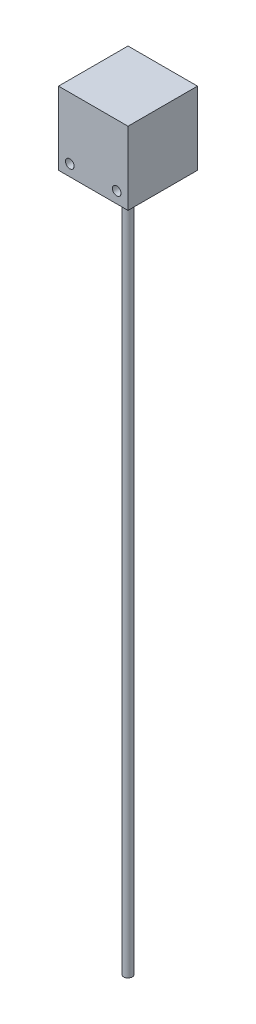
ISO-10303-21;
HEADER;
FILE_DESCRIPTION(('STEP AP214'),'2;1');
FILE_NAME('part.step','',(''),(''),'','','');
FILE_SCHEMA(('AUTOMOTIVE_DESIGN { 1 0 10303 214 1 1 1 1 }'));
ENDSEC;
DATA;
#1=APPLICATION_CONTEXT('core data for automotive mechanical design processes');
#2=APPLICATION_PROTOCOL_DEFINITION('international standard','automotive_design',2000,#1);
#3=PRODUCT_CONTEXT('',#1,'mechanical');
#4=PRODUCT('Part','Part','',(#3));
#5=PRODUCT_RELATED_PRODUCT_CATEGORY('part','',(#4));
#6=PRODUCT_DEFINITION_FORMATION('','',#4);
#7=PRODUCT_DEFINITION_CONTEXT('part definition',#1,'design');
#8=PRODUCT_DEFINITION('design','',#6,#7);
#9=PRODUCT_DEFINITION_SHAPE('','',#8);
#10=(LENGTH_UNIT() NAMED_UNIT(*) SI_UNIT(.MILLI.,.METRE.));
#11=(NAMED_UNIT(*) PLANE_ANGLE_UNIT() SI_UNIT($,.RADIAN.));
#12=(NAMED_UNIT(*) SI_UNIT($,.STERADIAN.) SOLID_ANGLE_UNIT());
#13=UNCERTAINTY_MEASURE_WITH_UNIT(LENGTH_MEASURE(1.E-05),#10,'distance_accuracy_value','');
#14=(GEOMETRIC_REPRESENTATION_CONTEXT(3) GLOBAL_UNCERTAINTY_ASSIGNED_CONTEXT((#13)) GLOBAL_UNIT_ASSIGNED_CONTEXT((#10,
#11,#12)) REPRESENTATION_CONTEXT('',''));
#15=CARTESIAN_POINT('',(0.,0.,0.));
#16=DIRECTION('',(0.,0.,1.));
#17=DIRECTION('',(1.,0.,0.));
#18=AXIS2_PLACEMENT_3D('',#15,#16,#17);
#19=CARTESIAN_POINT('',(0.,0.,20.));
#20=DIRECTION('',(0.,0.,1.));
#21=DIRECTION('',(1.,0.,0.));
#22=AXIS2_PLACEMENT_3D('',#19,#20,#21);
#23=PLANE('',#22);
#24=CARTESIAN_POINT('',(33.5,-35.5,20.));
#25=DIRECTION('',(0.,0.,1.));
#26=DIRECTION('',(1.,0.,0.));
#27=AXIS2_PLACEMENT_3D('',#24,#25,#26);
#28=CIRCLE('',#27,2.5);
#29=CARTESIAN_POINT('',(36.,-35.5,20.));
#30=VERTEX_POINT('',#29);
#31=EDGE_CURVE('E134',#30,#30,#28,.F.);
#32=ORIENTED_EDGE('',*,*,#31,.T.);
#33=EDGE_LOOP('',(#32));
#34=FACE_BOUND('',#33,.T.);
#35=DIRECTION('',(1.,0.,0.));
#36=VECTOR('',#35,1.);
#37=CARTESIAN_POINT('',(0.,-42.,20.));
#38=LINE('',#37,#36);
#39=CARTESIAN_POINT('',(0.,-42.,20.));
#40=VERTEX_POINT('',#39);
#41=CARTESIAN_POINT('',(40.,-42.,20.));
#42=VERTEX_POINT('',#41);
#43=EDGE_CURVE('E78',#40,#42,#38,.T.);
#44=ORIENTED_EDGE('',*,*,#43,.T.);
#45=DIRECTION('',(0.,-1.,0.));
#46=VECTOR('',#45,1.);
#47=CARTESIAN_POINT('',(40.,0.,20.));
#48=LINE('',#47,#46);
#49=CARTESIAN_POINT('',(40.,0.,20.));
#50=VERTEX_POINT('',#49);
#51=EDGE_CURVE('E85',#50,#42,#48,.T.);
#52=ORIENTED_EDGE('',*,*,#51,.F.);
#53=DIRECTION('',(1.,0.,0.));
#54=VECTOR('',#53,1.);
#55=CARTESIAN_POINT('',(0.,0.,20.));
#56=LINE('',#55,#54);
#57=CARTESIAN_POINT('',(0.,0.,20.));
#58=VERTEX_POINT('',#57);
#59=EDGE_CURVE('E93',#58,#50,#56,.T.);
#60=ORIENTED_EDGE('',*,*,#59,.F.);
#61=DIRECTION('',(0.,-1.,0.));
#62=VECTOR('',#61,1.);
#63=CARTESIAN_POINT('',(0.,0.,20.));
#64=LINE('',#63,#62);
#65=EDGE_CURVE('E55',#58,#40,#64,.T.);
#66=ORIENTED_EDGE('',*,*,#65,.T.);
#67=EDGE_LOOP('',(#44,#52,#60,#66));
#68=FACE_BOUND('',#67,.T.);
#69=CARTESIAN_POINT('',(6.5,-35.5,20.));
#70=DIRECTION('',(0.,0.,1.));
#71=DIRECTION('',(1.,0.,0.));
#72=AXIS2_PLACEMENT_3D('',#69,#70,#71);
#73=CIRCLE('',#72,2.5);
#74=CARTESIAN_POINT('',(9.00000000000001,-35.5,20.));
#75=VERTEX_POINT('',#74);
#76=EDGE_CURVE('E126',#75,#75,#73,.T.);
#77=ORIENTED_EDGE('',*,*,#76,.F.);
#78=EDGE_LOOP('',(#77));
#79=FACE_BOUND('',#78,.T.);
#80=ADVANCED_FACE('F38',(#34,#68,#79),#23,.T.);
#81=CARTESIAN_POINT('',(0.,0.,-20.));
#82=DIRECTION('',(0.,0.,1.));
#83=DIRECTION('',(1.,0.,0.));
#84=AXIS2_PLACEMENT_3D('',#81,#82,#83);
#85=PLANE('',#84);
#86=DIRECTION('',(1.,0.,0.));
#87=VECTOR('',#86,1.);
#88=CARTESIAN_POINT('',(0.,-42.,-20.));
#89=LINE('',#88,#87);
#90=CARTESIAN_POINT('',(0.,-42.,-20.));
#91=VERTEX_POINT('',#90);
#92=CARTESIAN_POINT('',(40.,-42.,-20.));
#93=VERTEX_POINT('',#92);
#94=EDGE_CURVE('E101',#91,#93,#89,.T.);
#95=ORIENTED_EDGE('',*,*,#94,.F.);
#96=DIRECTION('',(0.,-1.,0.));
#97=VECTOR('',#96,1.);
#98=CARTESIAN_POINT('',(0.,0.,-20.));
#99=LINE('',#98,#97);
#100=CARTESIAN_POINT('',(0.,0.,-20.));
#101=VERTEX_POINT('',#100);
#102=EDGE_CURVE('E73',#101,#91,#99,.T.);
#103=ORIENTED_EDGE('',*,*,#102,.F.);
#104=DIRECTION('',(1.,0.,0.));
#105=VECTOR('',#104,1.);
#106=CARTESIAN_POINT('',(0.,0.,-20.));
#107=LINE('',#106,#105);
#108=CARTESIAN_POINT('',(40.,0.,-20.));
#109=VERTEX_POINT('',#108);
#110=EDGE_CURVE('E106',#101,#109,#107,.T.);
#111=ORIENTED_EDGE('',*,*,#110,.T.);
#112=DIRECTION('',(0.,-1.,0.));
#113=VECTOR('',#112,1.);
#114=CARTESIAN_POINT('',(40.,0.,-20.));
#115=LINE('',#114,#113);
#116=EDGE_CURVE('E87',#109,#93,#115,.T.);
#117=ORIENTED_EDGE('',*,*,#116,.T.);
#118=EDGE_LOOP('',(#95,#103,#111,#117));
#119=FACE_BOUND('',#118,.T.);
#120=CARTESIAN_POINT('',(33.5,-35.5,-20.));
#121=DIRECTION('',(0.,0.,1.));
#122=DIRECTION('',(1.,0.,0.));
#123=AXIS2_PLACEMENT_3D('',#120,#121,#122);
#124=CIRCLE('',#123,2.5);
#125=CARTESIAN_POINT('',(36.,-35.5,-20.));
#126=VERTEX_POINT('',#125);
#127=EDGE_CURVE('E120',#126,#126,#124,.F.);
#128=ORIENTED_EDGE('',*,*,#127,.F.);
#129=EDGE_LOOP('',(#128));
#130=FACE_BOUND('',#129,.T.);
#131=CARTESIAN_POINT('',(6.5,-35.5,-20.));
#132=DIRECTION('',(0.,0.,1.));
#133=DIRECTION('',(1.,0.,0.));
#134=AXIS2_PLACEMENT_3D('',#131,#132,#133);
#135=CIRCLE('',#134,2.5);
#136=CARTESIAN_POINT('',(9.00000000000001,-35.5,-20.));
#137=VERTEX_POINT('',#136);
#138=EDGE_CURVE('E123',#137,#137,#135,.T.);
#139=ORIENTED_EDGE('',*,*,#138,.T.);
#140=EDGE_LOOP('',(#139));
#141=FACE_BOUND('',#140,.T.);
#142=ADVANCED_FACE('F113',(#119,#130,#141),#85,.F.);
#143=CARTESIAN_POINT('',(0.,-42.,20.));
#144=DIRECTION('',(0.,1.,0.));
#145=DIRECTION('',(0.,0.,1.));
#146=AXIS2_PLACEMENT_3D('',#143,#144,#145);
#147=PLANE('',#146);
#148=CARTESIAN_POINT('',(19.9999999999999,-42.,0.));
#149=DIRECTION('',(0.,1.,0.));
#150=DIRECTION('',(-1.,0.,0.));
#151=AXIS2_PLACEMENT_3D('',#148,#149,#150);
#152=CIRCLE('',#151,2.49999999999995);
#153=CARTESIAN_POINT('',(17.5,-42.,0.));
#154=VERTEX_POINT('',#153);
#155=EDGE_CURVE('E125',#154,#154,#152,.T.);
#156=ORIENTED_EDGE('',*,*,#155,.T.);
#157=EDGE_LOOP('',(#156));
#158=FACE_BOUND('',#157,.T.);
#159=ORIENTED_EDGE('',*,*,#94,.T.);
#160=DIRECTION('',(0.,0.,-1.));
#161=VECTOR('',#160,1.);
#162=CARTESIAN_POINT('',(40.,-42.,20.));
#163=LINE('',#162,#161);
#164=EDGE_CURVE('E11',#42,#93,#163,.T.);
#165=ORIENTED_EDGE('',*,*,#164,.F.);
#166=ORIENTED_EDGE('',*,*,#43,.F.);
#167=DIRECTION('',(0.,0.,-1.));
#168=VECTOR('',#167,1.);
#169=CARTESIAN_POINT('',(0.,-42.,20.));
#170=LINE('',#169,#168);
#171=EDGE_CURVE('E97',#40,#91,#170,.T.);
#172=ORIENTED_EDGE('',*,*,#171,.T.);
#173=EDGE_LOOP('',(#159,#165,#166,#172));
#174=FACE_BOUND('',#173,.T.);
#175=ADVANCED_FACE('F40',(#158,#174),#147,.F.);
#176=CARTESIAN_POINT('',(40.,0.,20.));
#177=DIRECTION('',(1.,0.,0.));
#178=DIRECTION('',(0.,0.,-1.));
#179=AXIS2_PLACEMENT_3D('',#176,#177,#178);
#180=PLANE('',#179);
#181=ORIENTED_EDGE('',*,*,#116,.F.);
#182=DIRECTION('',(0.,0.,-1.));
#183=VECTOR('',#182,1.);
#184=CARTESIAN_POINT('',(40.,0.,20.));
#185=LINE('',#184,#183);
#186=EDGE_CURVE('E47',#50,#109,#185,.T.);
#187=ORIENTED_EDGE('',*,*,#186,.F.);
#188=ORIENTED_EDGE('',*,*,#51,.T.);
#189=ORIENTED_EDGE('',*,*,#164,.T.);
#190=EDGE_LOOP('',(#181,#187,#188,#189));
#191=FACE_BOUND('',#190,.T.);
#192=ADVANCED_FACE('F84',(#191),#180,.T.);
#193=CARTESIAN_POINT('',(0.,0.,20.));
#194=DIRECTION('',(0.,1.,0.));
#195=DIRECTION('',(0.,0.,1.));
#196=AXIS2_PLACEMENT_3D('',#193,#194,#195);
#197=PLANE('',#196);
#198=ORIENTED_EDGE('',*,*,#110,.F.);
#199=DIRECTION('',(0.,0.,-1.));
#200=VECTOR('',#199,1.);
#201=CARTESIAN_POINT('',(0.,0.,20.));
#202=LINE('',#201,#200);
#203=EDGE_CURVE('E70',#58,#101,#202,.T.);
#204=ORIENTED_EDGE('',*,*,#203,.F.);
#205=ORIENTED_EDGE('',*,*,#59,.T.);
#206=ORIENTED_EDGE('',*,*,#186,.T.);
#207=EDGE_LOOP('',(#198,#204,#205,#206));
#208=FACE_BOUND('',#207,.T.);
#209=ADVANCED_FACE('F95',(#208),#197,.T.);
#210=CARTESIAN_POINT('',(0.,0.,20.));
#211=DIRECTION('',(1.,0.,0.));
#212=DIRECTION('',(0.,1.,0.));
#213=AXIS2_PLACEMENT_3D('',#210,#211,#212);
#214=PLANE('',#213);
#215=ORIENTED_EDGE('',*,*,#102,.T.);
#216=ORIENTED_EDGE('',*,*,#171,.F.);
#217=ORIENTED_EDGE('',*,*,#65,.F.);
#218=ORIENTED_EDGE('',*,*,#203,.T.);
#219=EDGE_LOOP('',(#215,#216,#217,#218));
#220=FACE_BOUND('',#219,.T.);
#221=ADVANCED_FACE('F145',(#220),#214,.F.);
#222=CARTESIAN_POINT('',(0.,-443.,0.));
#223=DIRECTION('',(0.,-1.,0.));
#224=DIRECTION('',(1.,0.,0.));
#225=AXIS2_PLACEMENT_3D('',#222,#223,#224);
#226=PLANE('',#225);
#227=CARTESIAN_POINT('',(20.,-443.,0.));
#228=DIRECTION('',(0.,1.,0.));
#229=DIRECTION('',(-1.,0.,0.));
#230=AXIS2_PLACEMENT_3D('',#227,#228,#229);
#231=CIRCLE('',#230,2.5);
#232=CARTESIAN_POINT('',(17.5,-443.,0.));
#233=VERTEX_POINT('',#232);
#234=EDGE_CURVE('E104',#233,#233,#231,.T.);
#235=ORIENTED_EDGE('',*,*,#234,.F.);
#236=EDGE_LOOP('',(#235));
#237=FACE_BOUND('',#236,.T.);
#238=ADVANCED_FACE('F143',(#237),#226,.T.);
#239=CARTESIAN_POINT('',(19.9999999999999,-42.,0.));
#240=DIRECTION('',(0.,1.,0.));
#241=DIRECTION('',(-1.,0.,0.));
#242=AXIS2_PLACEMENT_3D('',#239,#240,#241);
#243=CYLINDRICAL_SURFACE('',#242,2.49999999999998);
#244=ORIENTED_EDGE('',*,*,#234,.T.);
#245=EDGE_LOOP('',(#244));
#246=FACE_BOUND('',#245,.T.);
#247=ORIENTED_EDGE('',*,*,#155,.F.);
#248=EDGE_LOOP('',(#247));
#249=FACE_BOUND('',#248,.T.);
#250=ADVANCED_FACE('F140',(#246,#249),#243,.T.);
#251=CARTESIAN_POINT('',(33.5,-35.5,-20.));
#252=DIRECTION('',(0.,0.,1.));
#253=DIRECTION('',(1.,0.,0.));
#254=AXIS2_PLACEMENT_3D('',#251,#252,#253);
#255=CYLINDRICAL_SURFACE('',#254,2.5);
#256=ORIENTED_EDGE('',*,*,#127,.T.);
#257=EDGE_LOOP('',(#256));
#258=FACE_BOUND('',#257,.T.);
#259=ORIENTED_EDGE('',*,*,#31,.F.);
#260=EDGE_LOOP('',(#259));
#261=FACE_BOUND('',#260,.T.);
#262=ADVANCED_FACE('F151',(#258,#261),#255,.F.);
#263=CARTESIAN_POINT('',(6.5,-35.5,-20.));
#264=DIRECTION('',(0.,0.,1.));
#265=DIRECTION('',(1.,0.,0.));
#266=AXIS2_PLACEMENT_3D('',#263,#264,#265);
#267=CYLINDRICAL_SURFACE('',#266,2.5);
#268=ORIENTED_EDGE('',*,*,#138,.F.);
#269=EDGE_LOOP('',(#268));
#270=FACE_BOUND('',#269,.T.);
#271=ORIENTED_EDGE('',*,*,#76,.T.);
#272=EDGE_LOOP('',(#271));
#273=FACE_BOUND('',#272,.T.);
#274=ADVANCED_FACE('F187',(#270,#273),#267,.F.);
#275=CLOSED_SHELL('',(#80,#142,#175,#192,#209,#221,#238,#250,#262,#274));
#276=MANIFOLD_SOLID_BREP('B2',#275);
#277=ADVANCED_BREP_SHAPE_REPRESENTATION('',(#18,#276),#14);
#278=SHAPE_DEFINITION_REPRESENTATION(#9,#277);
ENDSEC;
END-ISO-10303-21;
